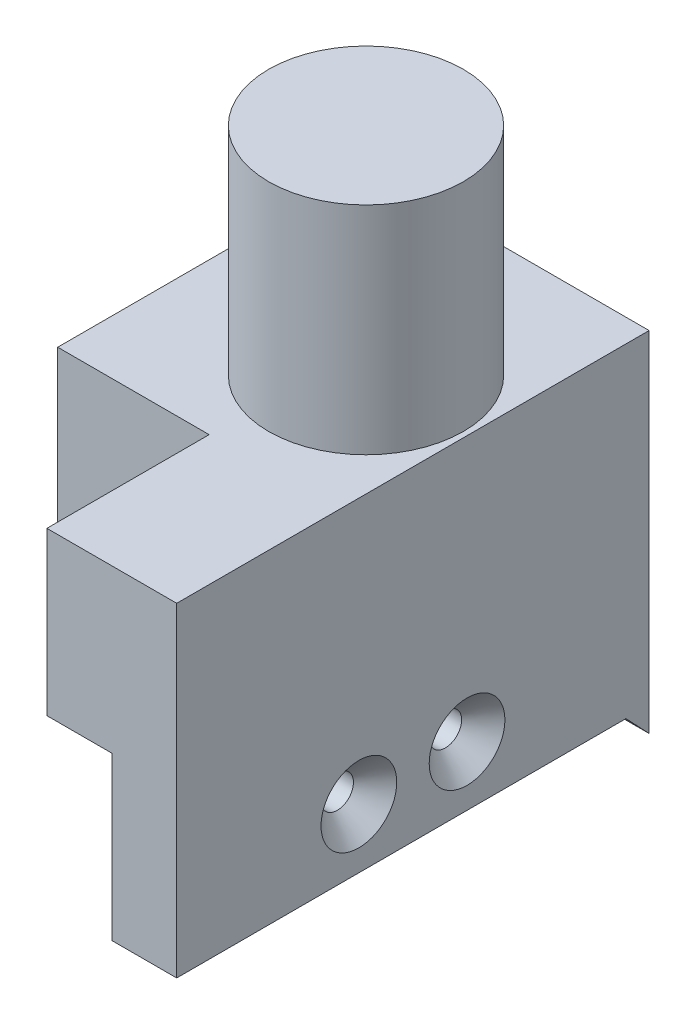
ISO-10303-21;
HEADER;
FILE_DESCRIPTION(('STEP AP214'),'2;1');
FILE_NAME('part.step','',(''),(''),'','','');
FILE_SCHEMA(('AUTOMOTIVE_DESIGN { 1 0 10303 214 1 1 1 1 }'));
ENDSEC;
DATA;
#1=APPLICATION_CONTEXT('core data for automotive mechanical design processes');
#2=APPLICATION_PROTOCOL_DEFINITION('international standard','automotive_design',2000,#1);
#3=PRODUCT_CONTEXT('',#1,'mechanical');
#4=PRODUCT('Part','Part','',(#3));
#5=PRODUCT_RELATED_PRODUCT_CATEGORY('part','',(#4));
#6=PRODUCT_DEFINITION_FORMATION('','',#4);
#7=PRODUCT_DEFINITION_CONTEXT('part definition',#1,'design');
#8=PRODUCT_DEFINITION('design','',#6,#7);
#9=PRODUCT_DEFINITION_SHAPE('','',#8);
#10=(LENGTH_UNIT() NAMED_UNIT(*) SI_UNIT(.MILLI.,.METRE.));
#11=(NAMED_UNIT(*) PLANE_ANGLE_UNIT() SI_UNIT($,.RADIAN.));
#12=(NAMED_UNIT(*) SI_UNIT($,.STERADIAN.) SOLID_ANGLE_UNIT());
#13=UNCERTAINTY_MEASURE_WITH_UNIT(LENGTH_MEASURE(1.E-05),#10,'distance_accuracy_value','');
#14=(GEOMETRIC_REPRESENTATION_CONTEXT(3) GLOBAL_UNCERTAINTY_ASSIGNED_CONTEXT((#13)) GLOBAL_UNIT_ASSIGNED_CONTEXT((#10,
#11,#12)) REPRESENTATION_CONTEXT('',''));
#15=CARTESIAN_POINT('',(0.,0.,0.));
#16=DIRECTION('',(0.,0.,1.));
#17=DIRECTION('',(1.,0.,0.));
#18=AXIS2_PLACEMENT_3D('',#15,#16,#17);
#19=CARTESIAN_POINT('',(0.,-30.,0.));
#20=DIRECTION('',(0.,1.,0.));
#21=DIRECTION('',(0.,0.,1.));
#22=AXIS2_PLACEMENT_3D('',#19,#20,#21);
#23=PLANE('',#22);
#24=DIRECTION('',(-1.,0.,0.));
#25=VECTOR('',#24,1.);
#26=CARTESIAN_POINT('',(12.6109990395367,-30.,-14.5320769368384));
#27=LINE('',#26,#25);
#28=CARTESIAN_POINT('',(9.5,-30.,-14.5320769368384));
#29=VERTEX_POINT('',#28);
#30=CARTESIAN_POINT('',(3.5,-30.,-14.5320769368384));
#31=VERTEX_POINT('',#30);
#32=EDGE_CURVE('E134',#29,#31,#27,.T.);
#33=ORIENTED_EDGE('',*,*,#32,.F.);
#34=DIRECTION('',(0.,0.,1.));
#35=VECTOR('',#34,1.);
#36=CARTESIAN_POINT('',(9.49999999999999,-30.,27.));
#37=LINE('',#36,#35);
#38=CARTESIAN_POINT('',(9.49999999999999,-30.,27.));
#39=VERTEX_POINT('',#38);
#40=EDGE_CURVE('E117',#29,#39,#37,.T.);
#41=ORIENTED_EDGE('',*,*,#40,.T.);
#42=DIRECTION('',(-1.,0.,0.));
#43=VECTOR('',#42,1.);
#44=CARTESIAN_POINT('',(3.5,-30.,27.));
#45=LINE('',#44,#43);
#46=CARTESIAN_POINT('',(3.5,-30.,27.));
#47=VERTEX_POINT('',#46);
#48=EDGE_CURVE('E129',#39,#47,#45,.T.);
#49=ORIENTED_EDGE('',*,*,#48,.T.);
#50=DIRECTION('',(0.,0.,-1.));
#51=VECTOR('',#50,1.);
#52=CARTESIAN_POINT('',(3.5,-30.,-8.2915619758885));
#53=LINE('',#52,#51);
#54=EDGE_CURVE('E130',#47,#31,#53,.T.);
#55=ORIENTED_EDGE('',*,*,#54,.T.);
#56=EDGE_LOOP('',(#33,#41,#49,#55));
#57=FACE_BOUND('',#56,.T.);
#58=ADVANCED_FACE('F37',(#57),#23,.F.);
#59=CARTESIAN_POINT('',(0.,20.,0.));
#60=DIRECTION('',(0.,-1.,0.));
#61=DIRECTION('',(0.,0.,-1.));
#62=AXIS2_PLACEMENT_3D('',#59,#60,#61);
#63=CYLINDRICAL_SURFACE('',#62,9.);
#64=CARTESIAN_POINT('',(0.,20.,0.));
#65=DIRECTION('',(0.,1.,0.));
#66=DIRECTION('',(0.,0.,1.));
#67=AXIS2_PLACEMENT_3D('',#64,#65,#66);
#68=CIRCLE('',#67,9.);
#69=CARTESIAN_POINT('',(0.,20.,9.));
#70=VERTEX_POINT('',#69);
#71=EDGE_CURVE('E189',#70,#70,#68,.T.);
#72=ORIENTED_EDGE('',*,*,#71,.F.);
#73=EDGE_LOOP('',(#72));
#74=FACE_BOUND('',#73,.T.);
#75=CARTESIAN_POINT('',(0.,0.,0.));
#76=DIRECTION('',(0.,1.,0.));
#77=DIRECTION('',(0.,0.,1.));
#78=AXIS2_PLACEMENT_3D('',#75,#76,#77);
#79=CIRCLE('',#78,9.);
#80=CARTESIAN_POINT('',(0.,0.,9.));
#81=VERTEX_POINT('',#80);
#82=EDGE_CURVE('E232',#81,#81,#79,.T.);
#83=ORIENTED_EDGE('',*,*,#82,.T.);
#84=EDGE_LOOP('',(#83));
#85=FACE_BOUND('',#84,.T.);
#86=ADVANCED_FACE('F250',(#74,#85),#63,.T.);
#87=CARTESIAN_POINT('',(0.,20.,0.));
#88=DIRECTION('',(0.,1.,0.));
#89=DIRECTION('',(0.,0.,1.));
#90=AXIS2_PLACEMENT_3D('',#87,#88,#89);
#91=PLANE('',#90);
#92=ORIENTED_EDGE('',*,*,#71,.T.);
#93=EDGE_LOOP('',(#92));
#94=FACE_BOUND('',#93,.T.);
#95=ADVANCED_FACE('F290',(#94),#91,.T.);
#96=CARTESIAN_POINT('',(-16.5,-15.,-16.67));
#97=DIRECTION('',(1.,0.,0.));
#98=DIRECTION('',(0.,0.,-1.));
#99=AXIS2_PLACEMENT_3D('',#96,#97,#98);
#100=PLANE('',#99);
#101=DIRECTION('',(0.,1.,0.));
#102=VECTOR('',#101,1.);
#103=CARTESIAN_POINT('',(-16.5,-15.,-16.67));
#104=LINE('',#103,#102);
#105=CARTESIAN_POINT('',(-16.5,-32.26,-16.67));
#106=VERTEX_POINT('',#105);
#107=CARTESIAN_POINT('',(-16.5,0.,-16.67));
#108=VERTEX_POINT('',#107);
#109=EDGE_CURVE('E221',#106,#108,#104,.T.);
#110=ORIENTED_EDGE('',*,*,#109,.F.);
#111=DIRECTION('',(0.,-0.726454740512095,-0.687214311541534));
#112=VECTOR('',#111,1.);
#113=CARTESIAN_POINT('',(-16.5,-28.0315971375361,-12.67));
#114=LINE('',#113,#112);
#115=CARTESIAN_POINT('',(-16.5,-28.0315971375361,-12.67));
#116=VERTEX_POINT('',#115);
#117=EDGE_CURVE('E157',#116,#106,#114,.T.);
#118=ORIENTED_EDGE('',*,*,#117,.F.);
#119=DIRECTION('',(0.,1.,0.));
#120=VECTOR('',#119,1.);
#121=CARTESIAN_POINT('',(-16.5,-32.26,-12.67));
#122=LINE('',#121,#120);
#123=CARTESIAN_POINT('',(-16.5,-15.,-12.67));
#124=VERTEX_POINT('',#123);
#125=EDGE_CURVE('E165',#116,#124,#122,.T.);
#126=ORIENTED_EDGE('',*,*,#125,.T.);
#127=DIRECTION('',(0.,0.,-1.));
#128=VECTOR('',#127,1.);
#129=CARTESIAN_POINT('',(-16.5,-15.,-16.67));
#130=LINE('',#129,#128);
#131=CARTESIAN_POINT('',(-16.5,-15.,12.));
#132=VERTEX_POINT('',#131);
#133=EDGE_CURVE('E220',#132,#124,#130,.T.);
#134=ORIENTED_EDGE('',*,*,#133,.F.);
#135=DIRECTION('',(0.,1.,0.));
#136=VECTOR('',#135,1.);
#137=CARTESIAN_POINT('',(-16.5,-15.,12.));
#138=LINE('',#137,#136);
#139=CARTESIAN_POINT('',(-16.5,0.,12.));
#140=VERTEX_POINT('',#139);
#141=EDGE_CURVE('E241',#132,#140,#138,.T.);
#142=ORIENTED_EDGE('',*,*,#141,.T.);
#143=DIRECTION('',(0.,0.,-1.));
#144=VECTOR('',#143,1.);
#145=CARTESIAN_POINT('',(-16.5,0.,-16.67));
#146=LINE('',#145,#144);
#147=EDGE_CURVE('E239',#140,#108,#146,.T.);
#148=ORIENTED_EDGE('',*,*,#147,.T.);
#149=EDGE_LOOP('',(#110,#118,#126,#134,#142,#148));
#150=FACE_BOUND('',#149,.T.);
#151=ADVANCED_FACE('F266',(#150),#100,.F.);
#152=CARTESIAN_POINT('',(3.5,-15.,-16.67));
#153=DIRECTION('',(0.,0.,1.));
#154=DIRECTION('',(1.,0.,0.));
#155=AXIS2_PLACEMENT_3D('',#152,#153,#154);
#156=PLANE('',#155);
#157=DIRECTION('',(1.,0.,0.));
#158=VECTOR('',#157,1.);
#159=CARTESIAN_POINT('',(3.5,0.,-16.67));
#160=LINE('',#159,#158);
#161=CARTESIAN_POINT('',(9.5,0.,-16.67));
#162=VERTEX_POINT('',#161);
#163=EDGE_CURVE('E228',#108,#162,#160,.T.);
#164=ORIENTED_EDGE('',*,*,#163,.T.);
#165=DIRECTION('',(0.,1.,0.));
#166=VECTOR('',#165,1.);
#167=CARTESIAN_POINT('',(9.5,-30.,-16.67));
#168=LINE('',#167,#166);
#169=CARTESIAN_POINT('',(9.5,-32.26,-16.67));
#170=VERTEX_POINT('',#169);
#171=EDGE_CURVE('E155',#170,#162,#168,.T.);
#172=ORIENTED_EDGE('',*,*,#171,.F.);
#173=DIRECTION('',(1.,0.,0.));
#174=VECTOR('',#173,1.);
#175=CARTESIAN_POINT('',(-16.5,-32.26,-16.67));
#176=LINE('',#175,#174);
#177=EDGE_CURVE('E139',#106,#170,#176,.T.);
#178=ORIENTED_EDGE('',*,*,#177,.F.);
#179=ORIENTED_EDGE('',*,*,#109,.T.);
#180=EDGE_LOOP('',(#164,#172,#178,#179));
#181=FACE_BOUND('',#180,.T.);
#182=ADVANCED_FACE('F280',(#181),#156,.F.);
#183=CARTESIAN_POINT('',(3.5,-15.,27.));
#184=DIRECTION('',(0.,0.,-1.));
#185=DIRECTION('',(-1.,0.,0.));
#186=AXIS2_PLACEMENT_3D('',#183,#184,#185);
#187=PLANE('',#186);
#188=DIRECTION('',(-1.,0.,0.));
#189=VECTOR('',#188,1.);
#190=CARTESIAN_POINT('',(3.5,0.,27.));
#191=LINE('',#190,#189);
#192=CARTESIAN_POINT('',(9.49999999999999,0.,27.));
#193=VERTEX_POINT('',#192);
#194=CARTESIAN_POINT('',(-2.5,0.,27.));
#195=VERTEX_POINT('',#194);
#196=EDGE_CURVE('E224',#193,#195,#191,.T.);
#197=ORIENTED_EDGE('',*,*,#196,.T.);
#198=DIRECTION('',(0.,1.,0.));
#199=VECTOR('',#198,1.);
#200=CARTESIAN_POINT('',(-2.5,-15.,27.));
#201=LINE('',#200,#199);
#202=CARTESIAN_POINT('',(-2.5,-15.,27.));
#203=VERTEX_POINT('',#202);
#204=EDGE_CURVE('E60',#203,#195,#201,.T.);
#205=ORIENTED_EDGE('',*,*,#204,.F.);
#206=DIRECTION('',(-1.,0.,0.));
#207=VECTOR('',#206,1.);
#208=CARTESIAN_POINT('',(3.5,-15.,27.));
#209=LINE('',#208,#207);
#210=CARTESIAN_POINT('',(3.5,-15.,27.));
#211=VERTEX_POINT('',#210);
#212=EDGE_CURVE('E219',#211,#203,#209,.T.);
#213=ORIENTED_EDGE('',*,*,#212,.F.);
#214=DIRECTION('',(0.,1.,0.));
#215=VECTOR('',#214,1.);
#216=CARTESIAN_POINT('',(3.5,-30.,27.));
#217=LINE('',#216,#215);
#218=EDGE_CURVE('E150',#47,#211,#217,.T.);
#219=ORIENTED_EDGE('',*,*,#218,.F.);
#220=ORIENTED_EDGE('',*,*,#48,.F.);
#221=DIRECTION('',(0.,1.,0.));
#222=VECTOR('',#221,1.);
#223=CARTESIAN_POINT('',(9.49999999999999,-30.,27.));
#224=LINE('',#223,#222);
#225=EDGE_CURVE('E125',#39,#193,#224,.T.);
#226=ORIENTED_EDGE('',*,*,#225,.T.);
#227=EDGE_LOOP('',(#197,#205,#213,#219,#220,#226));
#228=FACE_BOUND('',#227,.T.);
#229=ADVANCED_FACE('F278',(#228),#187,.F.);
#230=CARTESIAN_POINT('',(0.,-15.,0.));
#231=DIRECTION('',(0.,-1.,0.));
#232=DIRECTION('',(0.,0.,-1.));
#233=AXIS2_PLACEMENT_3D('',#230,#231,#232);
#234=PLANE('',#233);
#235=DIRECTION('',(-1.,0.,0.));
#236=VECTOR('',#235,1.);
#237=CARTESIAN_POINT('',(-16.5,-15.,-12.67));
#238=LINE('',#237,#236);
#239=CARTESIAN_POINT('',(3.5,-15.,-12.67));
#240=VERTEX_POINT('',#239);
#241=EDGE_CURVE('E163',#240,#124,#238,.T.);
#242=ORIENTED_EDGE('',*,*,#241,.F.);
#243=DIRECTION('',(0.,0.,1.));
#244=VECTOR('',#243,1.);
#245=CARTESIAN_POINT('',(3.5,-15.,-16.67));
#246=LINE('',#245,#244);
#247=EDGE_CURVE('E173',#240,#211,#246,.T.);
#248=ORIENTED_EDGE('',*,*,#247,.T.);
#249=ORIENTED_EDGE('',*,*,#212,.T.);
#250=DIRECTION('',(0.,0.,-1.));
#251=VECTOR('',#250,1.);
#252=CARTESIAN_POINT('',(-2.5,-15.,27.));
#253=LINE('',#252,#251);
#254=CARTESIAN_POINT('',(-2.5,-15.,12.));
#255=VERTEX_POINT('',#254);
#256=EDGE_CURVE('E168',#203,#255,#253,.T.);
#257=ORIENTED_EDGE('',*,*,#256,.T.);
#258=DIRECTION('',(-1.,0.,0.));
#259=VECTOR('',#258,1.);
#260=CARTESIAN_POINT('',(-2.5,-15.,12.));
#261=LINE('',#260,#259);
#262=EDGE_CURVE('E274',#255,#132,#261,.T.);
#263=ORIENTED_EDGE('',*,*,#262,.T.);
#264=ORIENTED_EDGE('',*,*,#133,.T.);
#265=EDGE_LOOP('',(#242,#248,#249,#257,#263,#264));
#266=FACE_BOUND('',#265,.T.);
#267=ADVANCED_FACE('F256',(#266),#234,.T.);
#268=CARTESIAN_POINT('',(0.,0.,0.));
#269=DIRECTION('',(0.,-1.,0.));
#270=DIRECTION('',(0.,0.,-1.));
#271=AXIS2_PLACEMENT_3D('',#268,#269,#270);
#272=PLANE('',#271);
#273=ORIENTED_EDGE('',*,*,#82,.F.);
#274=EDGE_LOOP('',(#273));
#275=FACE_BOUND('',#274,.T.);
#276=ORIENTED_EDGE('',*,*,#147,.F.);
#277=DIRECTION('',(-1.,0.,0.));
#278=VECTOR('',#277,1.);
#279=CARTESIAN_POINT('',(-2.5,0.,12.));
#280=LINE('',#279,#278);
#281=CARTESIAN_POINT('',(-2.5,0.,12.));
#282=VERTEX_POINT('',#281);
#283=EDGE_CURVE('E261',#282,#140,#280,.T.);
#284=ORIENTED_EDGE('',*,*,#283,.F.);
#285=DIRECTION('',(0.,0.,-1.));
#286=VECTOR('',#285,1.);
#287=CARTESIAN_POINT('',(-2.5,0.,27.));
#288=LINE('',#287,#286);
#289=EDGE_CURVE('E182',#195,#282,#288,.T.);
#290=ORIENTED_EDGE('',*,*,#289,.F.);
#291=ORIENTED_EDGE('',*,*,#196,.F.);
#292=DIRECTION('',(0.,0.,1.));
#293=VECTOR('',#292,1.);
#294=CARTESIAN_POINT('',(9.49999999999999,0.,27.));
#295=LINE('',#294,#293);
#296=EDGE_CURVE('E147',#162,#193,#295,.T.);
#297=ORIENTED_EDGE('',*,*,#296,.F.);
#298=ORIENTED_EDGE('',*,*,#163,.F.);
#299=EDGE_LOOP('',(#276,#284,#290,#291,#297,#298));
#300=FACE_BOUND('',#299,.T.);
#301=ADVANCED_FACE('F252',(#275,#300),#272,.F.);
#302=CARTESIAN_POINT('',(-2.5,-15.,12.));
#303=DIRECTION('',(0.,0.,-1.));
#304=DIRECTION('',(-1.,0.,0.));
#305=AXIS2_PLACEMENT_3D('',#302,#303,#304);
#306=PLANE('',#305);
#307=ORIENTED_EDGE('',*,*,#283,.T.);
#308=ORIENTED_EDGE('',*,*,#141,.F.);
#309=ORIENTED_EDGE('',*,*,#262,.F.);
#310=DIRECTION('',(0.,1.,0.));
#311=VECTOR('',#310,1.);
#312=CARTESIAN_POINT('',(-2.5,-15.,12.));
#313=LINE('',#312,#311);
#314=EDGE_CURVE('E270',#255,#282,#313,.T.);
#315=ORIENTED_EDGE('',*,*,#314,.T.);
#316=EDGE_LOOP('',(#307,#308,#309,#315));
#317=FACE_BOUND('',#316,.T.);
#318=ADVANCED_FACE('F255',(#317),#306,.F.);
#319=CARTESIAN_POINT('',(-2.5,-15.,27.));
#320=DIRECTION('',(1.,0.,0.));
#321=DIRECTION('',(0.,0.,-1.));
#322=AXIS2_PLACEMENT_3D('',#319,#320,#321);
#323=PLANE('',#322);
#324=ORIENTED_EDGE('',*,*,#289,.T.);
#325=ORIENTED_EDGE('',*,*,#314,.F.);
#326=ORIENTED_EDGE('',*,*,#256,.F.);
#327=ORIENTED_EDGE('',*,*,#204,.T.);
#328=EDGE_LOOP('',(#324,#325,#326,#327));
#329=FACE_BOUND('',#328,.T.);
#330=ADVANCED_FACE('F276',(#329),#323,.F.);
#331=CARTESIAN_POINT('',(-16.5,-32.26,-12.67));
#332=DIRECTION('',(0.,0.,-1.));
#333=DIRECTION('',(-1.,0.,0.));
#334=AXIS2_PLACEMENT_3D('',#331,#332,#333);
#335=PLANE('',#334);
#336=ORIENTED_EDGE('',*,*,#125,.F.);
#337=DIRECTION('',(-1.,0.,0.));
#338=VECTOR('',#337,1.);
#339=CARTESIAN_POINT('',(9.,-28.0315971375361,-12.67));
#340=LINE('',#339,#338);
#341=CARTESIAN_POINT('',(3.5,-28.0315971375361,-12.67));
#342=VERTEX_POINT('',#341);
#343=EDGE_CURVE('E159',#342,#116,#340,.T.);
#344=ORIENTED_EDGE('',*,*,#343,.F.);
#345=DIRECTION('',(0.,1.,0.));
#346=VECTOR('',#345,1.);
#347=CARTESIAN_POINT('',(3.5,-32.26,-12.67));
#348=LINE('',#347,#346);
#349=EDGE_CURVE('E52',#342,#240,#348,.T.);
#350=ORIENTED_EDGE('',*,*,#349,.T.);
#351=ORIENTED_EDGE('',*,*,#241,.T.);
#352=EDGE_LOOP('',(#336,#344,#350,#351));
#353=FACE_BOUND('',#352,.T.);
#354=ADVANCED_FACE('F305',(#353),#335,.F.);
#355=CARTESIAN_POINT('',(9.,-28.0315971375361,-12.67));
#356=DIRECTION('',(0.,0.687214311541534,-0.726454740512095));
#357=DIRECTION('',(0.,0.726454740512095,0.687214311541534));
#358=AXIS2_PLACEMENT_3D('',#355,#356,#357);
#359=PLANE('',#358);
#360=ORIENTED_EDGE('',*,*,#343,.T.);
#361=ORIENTED_EDGE('',*,*,#117,.T.);
#362=ORIENTED_EDGE('',*,*,#177,.T.);
#363=DIRECTION('',(0.,0.726454740512094,0.687214311541535));
#364=VECTOR('',#363,1.);
#365=CARTESIAN_POINT('',(9.5,-30.,-14.5320769368384));
#366=LINE('',#365,#364);
#367=EDGE_CURVE('E123',#170,#29,#366,.T.);
#368=ORIENTED_EDGE('',*,*,#367,.T.);
#369=ORIENTED_EDGE('',*,*,#32,.T.);
#370=DIRECTION('',(0.,-0.726454740512095,-0.687214311541534));
#371=VECTOR('',#370,1.);
#372=CARTESIAN_POINT('',(3.5,-23.1512681823843,-8.0532885712238));
#373=LINE('',#372,#371);
#374=EDGE_CURVE('E161',#342,#31,#373,.T.);
#375=ORIENTED_EDGE('',*,*,#374,.F.);
#376=EDGE_LOOP('',(#360,#361,#362,#368,#369,#375));
#377=FACE_BOUND('',#376,.T.);
#378=ADVANCED_FACE('F137',(#377),#359,.F.);
#379=CARTESIAN_POINT('',(9.49999999999999,-30.,27.));
#380=DIRECTION('',(-1.,0.,0.));
#381=DIRECTION('',(0.,0.,1.));
#382=AXIS2_PLACEMENT_3D('',#379,#380,#381);
#383=PLANE('',#382);
#384=CARTESIAN_POINT('',(9.49999999999999,-24.5,0.160000000000007));
#385=DIRECTION('',(-1.,0.,0.));
#386=DIRECTION('',(0.,0.,1.));
#387=AXIS2_PLACEMENT_3D('',#384,#385,#386);
#388=CIRCLE('',#387,3.50000000000007);
#389=CARTESIAN_POINT('',(9.49999999999999,-24.5,3.66000000000008));
#390=VERTEX_POINT('',#389);
#391=EDGE_CURVE('E45',#390,#390,#388,.T.);
#392=ORIENTED_EDGE('',*,*,#391,.T.);
#393=EDGE_LOOP('',(#392));
#394=FACE_BOUND('',#393,.T.);
#395=CARTESIAN_POINT('',(9.49999999999999,-24.5,10.16));
#396=DIRECTION('',(-1.,0.,0.));
#397=DIRECTION('',(0.,0.,1.));
#398=AXIS2_PLACEMENT_3D('',#395,#396,#397);
#399=CIRCLE('',#398,3.50000000000007);
#400=CARTESIAN_POINT('',(9.49999999999999,-24.5,13.6600000000001));
#401=VERTEX_POINT('',#400);
#402=EDGE_CURVE('E188',#401,#401,#399,.T.);
#403=ORIENTED_EDGE('',*,*,#402,.T.);
#404=EDGE_LOOP('',(#403));
#405=FACE_BOUND('',#404,.T.);
#406=ORIENTED_EDGE('',*,*,#296,.T.);
#407=ORIENTED_EDGE('',*,*,#225,.F.);
#408=ORIENTED_EDGE('',*,*,#40,.F.);
#409=ORIENTED_EDGE('',*,*,#367,.F.);
#410=ORIENTED_EDGE('',*,*,#171,.T.);
#411=EDGE_LOOP('',(#406,#407,#408,#409,#410));
#412=FACE_BOUND('',#411,.T.);
#413=ADVANCED_FACE('F120',(#394,#405,#412),#383,.F.);
#414=CARTESIAN_POINT('',(3.5,-30.,8.29156197588849));
#415=DIRECTION('',(1.,0.,0.));
#416=DIRECTION('',(0.,0.,-1.));
#417=AXIS2_PLACEMENT_3D('',#414,#415,#416);
#418=PLANE('',#417);
#419=CARTESIAN_POINT('',(3.5,-24.5,0.160000000000006));
#420=DIRECTION('',(1.,0.,0.));
#421=DIRECTION('',(0.,0.,-1.));
#422=AXIS2_PLACEMENT_3D('',#419,#420,#421);
#423=CIRCLE('',#422,1.5);
#424=CARTESIAN_POINT('',(3.5,-24.5,-1.34));
#425=VERTEX_POINT('',#424);
#426=EDGE_CURVE('E141',#425,#425,#423,.T.);
#427=ORIENTED_EDGE('',*,*,#426,.T.);
#428=EDGE_LOOP('',(#427));
#429=FACE_BOUND('',#428,.T.);
#430=CARTESIAN_POINT('',(3.5,-24.5,10.16));
#431=DIRECTION('',(1.,0.,0.));
#432=DIRECTION('',(0.,0.,-1.));
#433=AXIS2_PLACEMENT_3D('',#430,#431,#432);
#434=CIRCLE('',#433,1.5);
#435=CARTESIAN_POINT('',(3.5,-24.5,8.66));
#436=VERTEX_POINT('',#435);
#437=EDGE_CURVE('E144',#436,#436,#434,.T.);
#438=ORIENTED_EDGE('',*,*,#437,.T.);
#439=EDGE_LOOP('',(#438));
#440=FACE_BOUND('',#439,.T.);
#441=ORIENTED_EDGE('',*,*,#247,.F.);
#442=ORIENTED_EDGE('',*,*,#349,.F.);
#443=ORIENTED_EDGE('',*,*,#374,.T.);
#444=ORIENTED_EDGE('',*,*,#54,.F.);
#445=ORIENTED_EDGE('',*,*,#218,.T.);
#446=EDGE_LOOP('',(#441,#442,#443,#444,#445));
#447=FACE_BOUND('',#446,.T.);
#448=ADVANCED_FACE('F208',(#429,#440,#447),#418,.F.);
#449=CARTESIAN_POINT('',(-16.50005,-24.5,10.16));
#450=DIRECTION('',(1.,0.,0.));
#451=DIRECTION('',(0.,0.,-1.));
#452=AXIS2_PLACEMENT_3D('',#449,#450,#451);
#453=CYLINDRICAL_SURFACE('',#452,1.5);
#454=CARTESIAN_POINT('',(7.49999999999993,-24.5,10.16));
#455=DIRECTION('',(-1.,0.,0.));
#456=DIRECTION('',(0.,0.,1.));
#457=AXIS2_PLACEMENT_3D('',#454,#455,#456);
#458=CIRCLE('',#457,1.5);
#459=CARTESIAN_POINT('',(7.49999999999993,-24.5,8.66000000000001));
#460=VERTEX_POINT('',#459);
#461=EDGE_CURVE('E11',#460,#460,#458,.F.);
#462=CARTESIAN_POINT('',(7.49999999999993,-24.5,8.66000000000001));
#463=CARTESIAN_POINT('',(7.45833333333327,-24.5,8.66000000000001));
#464=CARTESIAN_POINT('',(7.4166666666666,-24.5,8.66000000000001));
#465=CARTESIAN_POINT('',(7.33333333333327,-24.5,8.66000000000001));
#466=CARTESIAN_POINT('',(7.2916666666666,-24.5,8.66000000000001));
#467=CARTESIAN_POINT('',(7.20833333333327,-24.5,8.66000000000001));
#468=CARTESIAN_POINT('',(7.16666666666661,-24.5,8.66000000000001));
#469=CARTESIAN_POINT('',(7.08333333333327,-24.5,8.66000000000001));
#470=CARTESIAN_POINT('',(7.04166666666661,-24.5,8.66000000000001));
#471=CARTESIAN_POINT('',(6.95833333333327,-24.5,8.66000000000001));
#472=CARTESIAN_POINT('',(6.91666666666661,-24.5,8.66000000000001));
#473=CARTESIAN_POINT('',(6.83333333333328,-24.5,8.66000000000001));
#474=CARTESIAN_POINT('',(6.79166666666661,-24.5,8.66000000000001));
#475=CARTESIAN_POINT('',(6.70833333333328,-24.5,8.66000000000001));
#476=CARTESIAN_POINT('',(6.66666666666661,-24.5,8.66000000000001));
#477=CARTESIAN_POINT('',(6.58333333333328,-24.5,8.66000000000001));
#478=CARTESIAN_POINT('',(6.54166666666662,-24.5,8.66000000000001));
#479=CARTESIAN_POINT('',(6.45833333333329,-24.5,8.66000000000001));
#480=CARTESIAN_POINT('',(6.41666666666662,-24.5,8.66000000000001));
#481=CARTESIAN_POINT('',(6.33333333333329,-24.5,8.66000000000001));
#482=CARTESIAN_POINT('',(6.29166666666662,-24.5,8.66000000000001));
#483=CARTESIAN_POINT('',(6.20833333333329,-24.5,8.66000000000001));
#484=CARTESIAN_POINT('',(6.16666666666662,-24.5,8.66000000000001));
#485=CARTESIAN_POINT('',(6.08333333333329,-24.5,8.66000000000001));
#486=CARTESIAN_POINT('',(6.04166666666663,-24.5,8.66000000000001));
#487=CARTESIAN_POINT('',(5.95833333333329,-24.5,8.66000000000001));
#488=CARTESIAN_POINT('',(5.91666666666663,-24.5,8.66000000000001));
#489=CARTESIAN_POINT('',(5.83333333333329,-24.5,8.66000000000001));
#490=CARTESIAN_POINT('',(5.79166666666663,-24.5,8.66000000000001));
#491=CARTESIAN_POINT('',(5.7083333333333,-24.5,8.66000000000001));
#492=CARTESIAN_POINT('',(5.66666666666663,-24.5,8.66000000000001));
#493=CARTESIAN_POINT('',(5.5833333333333,-24.5,8.66000000000001));
#494=CARTESIAN_POINT('',(5.54166666666663,-24.5,8.66000000000001));
#495=CARTESIAN_POINT('',(5.4583333333333,-24.5,8.66000000000001));
#496=CARTESIAN_POINT('',(5.41666666666664,-24.5,8.66000000000001));
#497=CARTESIAN_POINT('',(5.3333333333333,-24.5,8.66000000000001));
#498=CARTESIAN_POINT('',(5.29166666666664,-24.5,8.66));
#499=CARTESIAN_POINT('',(5.2083333333333,-24.5,8.66));
#500=CARTESIAN_POINT('',(5.16666666666664,-24.5,8.66));
#501=CARTESIAN_POINT('',(5.08333333333331,-24.5,8.66));
#502=CARTESIAN_POINT('',(5.04166666666664,-24.5,8.66));
#503=CARTESIAN_POINT('',(4.95833333333331,-24.5,8.66));
#504=CARTESIAN_POINT('',(4.91666666666664,-24.5,8.66));
#505=CARTESIAN_POINT('',(4.83333333333331,-24.5,8.66));
#506=CARTESIAN_POINT('',(4.79166666666665,-24.5,8.66));
#507=CARTESIAN_POINT('',(4.70833333333331,-24.5,8.66));
#508=CARTESIAN_POINT('',(4.66666666666665,-24.5,8.66));
#509=CARTESIAN_POINT('',(4.58333333333331,-24.5,8.66));
#510=CARTESIAN_POINT('',(4.54166666666665,-24.5,8.66));
#511=CARTESIAN_POINT('',(4.45833333333332,-24.5,8.66));
#512=CARTESIAN_POINT('',(4.41666666666665,-24.5,8.66));
#513=CARTESIAN_POINT('',(4.33333333333332,-24.5,8.66));
#514=CARTESIAN_POINT('',(4.29166666666665,-24.5,8.66));
#515=CARTESIAN_POINT('',(4.20833333333332,-24.5,8.66));
#516=CARTESIAN_POINT('',(4.16666666666666,-24.5,8.66));
#517=CARTESIAN_POINT('',(4.08333333333332,-24.5,8.66));
#518=CARTESIAN_POINT('',(4.04166666666666,-24.5,8.66));
#519=CARTESIAN_POINT('',(3.95833333333333,-24.5,8.66));
#520=CARTESIAN_POINT('',(3.91666666666666,-24.5,8.66));
#521=CARTESIAN_POINT('',(3.83333333333333,-24.5,8.66));
#522=CARTESIAN_POINT('',(3.79166666666666,-24.5,8.66));
#523=CARTESIAN_POINT('',(3.70833333333333,-24.5,8.66));
#524=CARTESIAN_POINT('',(3.66666666666666,-24.5,8.66));
#525=CARTESIAN_POINT('',(3.58333333333333,-24.5,8.66));
#526=CARTESIAN_POINT('',(3.54166666666667,-24.5,8.66));
#527=CARTESIAN_POINT('',(3.5,-24.5,8.66));
#528=B_SPLINE_CURVE_WITH_KNOTS('',3,(#462,#463,#464,#465,#466,#467,#468,#469,#470,#471,#472,
#473,#474,#475,#476,#477,#478,#479,#480,#481,#482,#483,#484,#485,#486,#487,#488,#489,#490,#491,
#492,#493,#494,#495,#496,#497,#498,#499,#500,#501,#502,#503,#504,#505,#506,#507,#508,#509,#510,
#511,#512,#513,#514,#515,#516,#517,#518,#519,#520,#521,#522,#523,#524,#525,#526,#527),
.UNSPECIFIED.,.F.,.F.,(4,2,2,2,2,2,2,2,2,2,2,2,2,2,2,2,2,2,2,2,2,2,2,2,2,2,2,2,2,2,2,2,4),(0.,
0.124999999999997,0.249999999999997,0.374999999999993,0.499999999999994,0.62499999999999,
0.749999999999987,0.874999999999987,0.999999999999984,1.12499999999998,1.24999999999998,
1.37499999999998,1.49999999999997,1.62499999999997,1.74999999999997,1.87499999999997,
1.99999999999997,2.12499999999996,2.24999999999996,2.37499999999996,2.49999999999996,
2.62499999999996,2.74999999999995,2.87499999999995,2.99999999999995,3.12499999999995,
3.24999999999995,3.37499999999994,3.49999999999994,3.62499999999994,3.74999999999994,
3.87499999999994,3.99999999999993),.UNSPECIFIED.);
#529=EDGE_CURVE('BSEAM204',#460,#436,#528,.T.);
#530=ORIENTED_EDGE('',*,*,#461,.T.);
#531=ORIENTED_EDGE('',*,*,#437,.F.);
#532=ORIENTED_EDGE('',*,*,#529,.T.);
#533=ORIENTED_EDGE('',*,*,#529,.F.);
#534=EDGE_LOOP('',(#530,#532,#531,#533));
#535=FACE_BOUND('',#534,.T.);
#536=ADVANCED_FACE('F204',(#535),#453,.F.);
#537=CARTESIAN_POINT('',(-16.50005,-24.5,0.160000000000004));
#538=DIRECTION('',(1.,0.,0.));
#539=DIRECTION('',(0.,0.,-1.));
#540=AXIS2_PLACEMENT_3D('',#537,#538,#539);
#541=CYLINDRICAL_SURFACE('',#540,1.5);
#542=CARTESIAN_POINT('',(7.49999999999993,-24.5,0.160000000000007));
#543=DIRECTION('',(-1.,0.,0.));
#544=DIRECTION('',(0.,0.,1.));
#545=AXIS2_PLACEMENT_3D('',#542,#543,#544);
#546=CIRCLE('',#545,1.5);
#547=CARTESIAN_POINT('',(7.49999999999993,-24.5,-1.33999999999999));
#548=VERTEX_POINT('',#547);
#549=EDGE_CURVE('E185',#548,#548,#546,.F.);
#550=CARTESIAN_POINT('',(7.49999999999993,-24.5,-1.33999999999999));
#551=CARTESIAN_POINT('',(7.45833333333326,-24.5,-1.33999999999999));
#552=CARTESIAN_POINT('',(7.4166666666666,-24.5,-1.33999999999999));
#553=CARTESIAN_POINT('',(7.33333333333327,-24.5,-1.33999999999999));
#554=CARTESIAN_POINT('',(7.2916666666666,-24.5,-1.33999999999999));
#555=CARTESIAN_POINT('',(7.20833333333327,-24.5,-1.33999999999999));
#556=CARTESIAN_POINT('',(7.1666666666666,-24.5,-1.33999999999999));
#557=CARTESIAN_POINT('',(7.08333333333327,-24.5,-1.33999999999999));
#558=CARTESIAN_POINT('',(7.0416666666666,-24.5,-1.33999999999999));
#559=CARTESIAN_POINT('',(6.95833333333327,-24.5,-1.33999999999999));
#560=CARTESIAN_POINT('',(6.91666666666661,-24.5,-1.33999999999999));
#561=CARTESIAN_POINT('',(6.83333333333327,-24.5,-1.33999999999999));
#562=CARTESIAN_POINT('',(6.79166666666661,-24.5,-1.33999999999999));
#563=CARTESIAN_POINT('',(6.70833333333328,-24.5,-1.33999999999999));
#564=CARTESIAN_POINT('',(6.66666666666661,-24.5,-1.33999999999999));
#565=CARTESIAN_POINT('',(6.58333333333328,-24.5,-1.33999999999999));
#566=CARTESIAN_POINT('',(6.54166666666661,-24.5,-1.33999999999999));
#567=CARTESIAN_POINT('',(6.45833333333328,-24.5,-1.33999999999999));
#568=CARTESIAN_POINT('',(6.41666666666662,-24.5,-1.33999999999999));
#569=CARTESIAN_POINT('',(6.33333333333328,-24.5,-1.33999999999999));
#570=CARTESIAN_POINT('',(6.29166666666662,-24.5,-1.33999999999999));
#571=CARTESIAN_POINT('',(6.20833333333328,-24.5,-1.33999999999999));
#572=CARTESIAN_POINT('',(6.16666666666662,-24.5,-1.33999999999999));
#573=CARTESIAN_POINT('',(6.08333333333329,-24.5,-1.33999999999999));
#574=CARTESIAN_POINT('',(6.04166666666662,-24.5,-1.33999999999999));
#575=CARTESIAN_POINT('',(5.95833333333329,-24.5,-1.33999999999999));
#576=CARTESIAN_POINT('',(5.91666666666662,-24.5,-1.33999999999999));
#577=CARTESIAN_POINT('',(5.83333333333329,-24.5,-1.33999999999999));
#578=CARTESIAN_POINT('',(5.79166666666663,-24.5,-1.33999999999999));
#579=CARTESIAN_POINT('',(5.70833333333329,-24.5,-1.33999999999999));
#580=CARTESIAN_POINT('',(5.66666666666663,-24.5,-1.33999999999999));
#581=CARTESIAN_POINT('',(5.58333333333329,-24.5,-1.33999999999999));
#582=CARTESIAN_POINT('',(5.54166666666663,-24.5,-1.33999999999999));
#583=CARTESIAN_POINT('',(5.4583333333333,-24.5,-1.33999999999999));
#584=CARTESIAN_POINT('',(5.41666666666663,-24.5,-1.33999999999999));
#585=CARTESIAN_POINT('',(5.3333333333333,-24.5,-1.33999999999999));
#586=CARTESIAN_POINT('',(5.29166666666663,-24.5,-1.33999999999999));
#587=CARTESIAN_POINT('',(5.2083333333333,-24.5,-1.33999999999999));
#588=CARTESIAN_POINT('',(5.16666666666663,-24.5,-1.33999999999999));
#589=CARTESIAN_POINT('',(5.0833333333333,-24.5,-1.33999999999999));
#590=CARTESIAN_POINT('',(5.04166666666664,-24.5,-1.33999999999999));
#591=CARTESIAN_POINT('',(4.9583333333333,-24.5,-1.33999999999999));
#592=CARTESIAN_POINT('',(4.91666666666664,-24.5,-1.33999999999999));
#593=CARTESIAN_POINT('',(4.83333333333331,-24.5,-1.33999999999999));
#594=CARTESIAN_POINT('',(4.79166666666664,-24.5,-1.33999999999999));
#595=CARTESIAN_POINT('',(4.70833333333331,-24.5,-1.33999999999999));
#596=CARTESIAN_POINT('',(4.66666666666664,-24.5,-1.33999999999999));
#597=CARTESIAN_POINT('',(4.58333333333331,-24.5,-1.33999999999999));
#598=CARTESIAN_POINT('',(4.54166666666665,-24.5,-1.33999999999999));
#599=CARTESIAN_POINT('',(4.45833333333331,-24.5,-1.33999999999999));
#600=CARTESIAN_POINT('',(4.41666666666665,-24.5,-1.34));
#601=CARTESIAN_POINT('',(4.33333333333332,-24.5,-1.34));
#602=CARTESIAN_POINT('',(4.29166666666665,-24.5,-1.34));
#603=CARTESIAN_POINT('',(4.20833333333332,-24.5,-1.34));
#604=CARTESIAN_POINT('',(4.16666666666665,-24.5,-1.34));
#605=CARTESIAN_POINT('',(4.08333333333332,-24.5,-1.34));
#606=CARTESIAN_POINT('',(4.04166666666666,-24.5,-1.34));
#607=CARTESIAN_POINT('',(3.95833333333332,-24.5,-1.34));
#608=CARTESIAN_POINT('',(3.91666666666666,-24.5,-1.34));
#609=CARTESIAN_POINT('',(3.83333333333332,-24.5,-1.34));
#610=CARTESIAN_POINT('',(3.79166666666666,-24.5,-1.34));
#611=CARTESIAN_POINT('',(3.70833333333333,-24.5,-1.34));
#612=CARTESIAN_POINT('',(3.66666666666666,-24.5,-1.34));
#613=CARTESIAN_POINT('',(3.58333333333333,-24.5,-1.34));
#614=CARTESIAN_POINT('',(3.54166666666666,-24.5,-1.34));
#615=CARTESIAN_POINT('',(3.5,-24.5,-1.34));
#616=B_SPLINE_CURVE_WITH_KNOTS('',3,(#550,#551,#552,#553,#554,#555,#556,#557,#558,#559,#560,
#561,#562,#563,#564,#565,#566,#567,#568,#569,#570,#571,#572,#573,#574,#575,#576,#577,#578,#579,
#580,#581,#582,#583,#584,#585,#586,#587,#588,#589,#590,#591,#592,#593,#594,#595,#596,#597,#598,
#599,#600,#601,#602,#603,#604,#605,#606,#607,#608,#609,#610,#611,#612,#613,#614,#615),
.UNSPECIFIED.,.F.,.F.,(4,2,2,2,2,2,2,2,2,2,2,2,2,2,2,2,2,2,2,2,2,2,2,2,2,2,2,2,2,2,2,2,4),(0.,
0.124999999999997,0.249999999999997,0.374999999999993,0.499999999999994,0.62499999999999,
0.749999999999987,0.874999999999987,0.999999999999984,1.12499999999998,1.24999999999998,
1.37499999999998,1.49999999999997,1.62499999999997,1.74999999999997,1.87499999999997,
1.99999999999997,2.12499999999996,2.24999999999996,2.37499999999996,2.49999999999996,
2.62499999999996,2.74999999999995,2.87499999999995,2.99999999999995,3.12499999999995,
3.24999999999995,3.37499999999994,3.49999999999994,3.62499999999994,3.74999999999994,
3.87499999999994,3.99999999999993),.UNSPECIFIED.);
#617=EDGE_CURVE('BSEAM199',#548,#425,#616,.T.);
#618=ORIENTED_EDGE('',*,*,#549,.T.);
#619=ORIENTED_EDGE('',*,*,#426,.F.);
#620=ORIENTED_EDGE('',*,*,#617,.T.);
#621=ORIENTED_EDGE('',*,*,#617,.F.);
#622=EDGE_LOOP('',(#618,#620,#619,#621));
#623=FACE_BOUND('',#622,.T.);
#624=ADVANCED_FACE('F199',(#623),#541,.F.);
#625=CARTESIAN_POINT('',(7.49999999999993,-24.5,0.160000000000007));
#626=DIRECTION('',(1.,0.,0.));
#627=DIRECTION('',(0.,0.,-1.));
#628=AXIS2_PLACEMENT_3D('',#625,#626,#627);
#629=CONICAL_SURFACE('',#628,1.5,0.78539816339745);
#630=ORIENTED_EDGE('',*,*,#391,.F.);
#631=EDGE_LOOP('',(#630));
#632=FACE_BOUND('',#631,.T.);
#633=ORIENTED_EDGE('',*,*,#549,.F.);
#634=EDGE_LOOP('',(#633));
#635=FACE_BOUND('',#634,.T.);
#636=ADVANCED_FACE('F196',(#632,#635),#629,.F.);
#637=CARTESIAN_POINT('',(7.49999999999993,-24.5,10.16));
#638=DIRECTION('',(1.,0.,0.));
#639=DIRECTION('',(0.,0.,-1.));
#640=AXIS2_PLACEMENT_3D('',#637,#638,#639);
#641=CONICAL_SURFACE('',#640,1.5,0.78539816339745);
#642=ORIENTED_EDGE('',*,*,#402,.F.);
#643=EDGE_LOOP('',(#642));
#644=FACE_BOUND('',#643,.T.);
#645=ORIENTED_EDGE('',*,*,#461,.F.);
#646=EDGE_LOOP('',(#645));
#647=FACE_BOUND('',#646,.T.);
#648=ADVANCED_FACE('F39',(#644,#647),#641,.F.);
#649=CLOSED_SHELL('',(#58,#86,#95,#151,#182,#229,#267,#301,#318,#330,#354,#378,#413,#448,#536,
#624,#636,#648));
#650=MANIFOLD_SOLID_BREP('B2',#649);
#651=ADVANCED_BREP_SHAPE_REPRESENTATION('',(#18,#650),#14);
#652=SHAPE_DEFINITION_REPRESENTATION(#9,#651);
ENDSEC;
END-ISO-10303-21;
